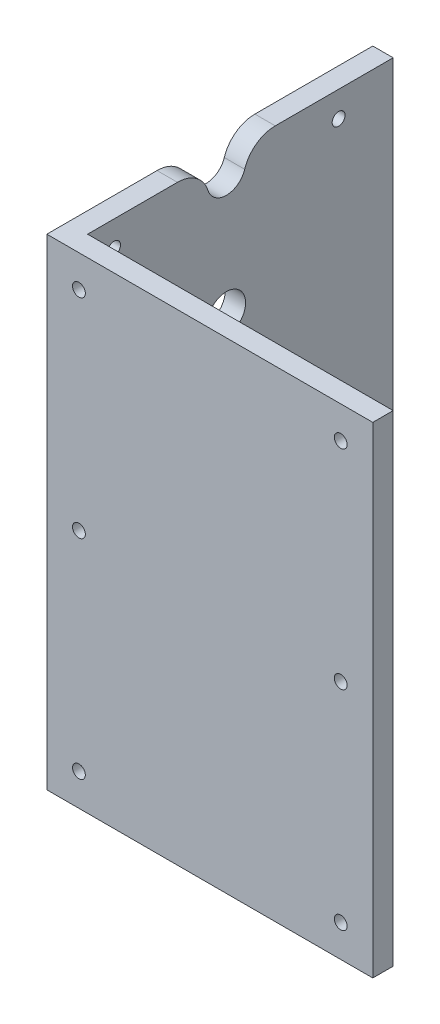
ISO-10303-21;
HEADER;
FILE_DESCRIPTION(('STEP AP214'),'2;1');
FILE_NAME('part.step','',(''),(''),'','','');
FILE_SCHEMA(('AUTOMOTIVE_DESIGN { 1 0 10303 214 1 1 1 1 }'));
ENDSEC;
DATA;
#1=APPLICATION_CONTEXT('core data for automotive mechanical design processes');
#2=APPLICATION_PROTOCOL_DEFINITION('international standard','automotive_design',2000,#1);
#3=PRODUCT_CONTEXT('',#1,'mechanical');
#4=PRODUCT('Part','Part','',(#3));
#5=PRODUCT_RELATED_PRODUCT_CATEGORY('part','',(#4));
#6=PRODUCT_DEFINITION_FORMATION('','',#4);
#7=PRODUCT_DEFINITION_CONTEXT('part definition',#1,'design');
#8=PRODUCT_DEFINITION('design','',#6,#7);
#9=PRODUCT_DEFINITION_SHAPE('','',#8);
#10=(LENGTH_UNIT() NAMED_UNIT(*) SI_UNIT(.MILLI.,.METRE.));
#11=(NAMED_UNIT(*) PLANE_ANGLE_UNIT() SI_UNIT($,.RADIAN.));
#12=(NAMED_UNIT(*) SI_UNIT($,.STERADIAN.) SOLID_ANGLE_UNIT());
#13=UNCERTAINTY_MEASURE_WITH_UNIT(LENGTH_MEASURE(1.E-05),#10,'distance_accuracy_value','');
#14=(GEOMETRIC_REPRESENTATION_CONTEXT(3) GLOBAL_UNCERTAINTY_ASSIGNED_CONTEXT((#13)) GLOBAL_UNIT_ASSIGNED_CONTEXT((#10,
#11,#12)) REPRESENTATION_CONTEXT('',''));
#15=CARTESIAN_POINT('',(0.,0.,0.));
#16=DIRECTION('',(0.,0.,1.));
#17=DIRECTION('',(1.,0.,0.));
#18=AXIS2_PLACEMENT_3D('',#15,#16,#17);
#19=CARTESIAN_POINT('',(101.6,59.96,-49.6));
#20=DIRECTION('',(-1.,0.,0.));
#21=DIRECTION('',(0.,0.,1.));
#22=AXIS2_PLACEMENT_3D('',#19,#20,#21);
#23=CYLINDRICAL_SURFACE('',#22,11.);
#24=CARTESIAN_POINT('',(6.34999999999999,59.96,-49.6));
#25=DIRECTION('',(-1.,0.,0.));
#26=DIRECTION('',(0.,0.,1.));
#27=AXIS2_PLACEMENT_3D('',#24,#25,#26);
#28=CIRCLE('',#27,11.);
#29=CARTESIAN_POINT('',(6.34999999999999,59.96,-38.6));
#30=VERTEX_POINT('',#29);
#31=EDGE_CURVE('E161',#30,#30,#28,.T.);
#32=ORIENTED_EDGE('',*,*,#31,.F.);
#33=EDGE_LOOP('',(#32));
#34=FACE_BOUND('',#33,.T.);
#35=CARTESIAN_POINT('',(1.5,59.96,-49.6));
#36=DIRECTION('',(-1.,0.,0.));
#37=DIRECTION('',(0.,0.,1.));
#38=AXIS2_PLACEMENT_3D('',#35,#36,#37);
#39=CIRCLE('',#38,11.);
#40=CARTESIAN_POINT('',(1.5,59.96,-38.6));
#41=VERTEX_POINT('',#40);
#42=EDGE_CURVE('E182',#41,#41,#39,.F.);
#43=ORIENTED_EDGE('',*,*,#42,.F.);
#44=EDGE_LOOP('',(#43));
#45=FACE_BOUND('',#44,.T.);
#46=ADVANCED_FACE('F40',(#34,#45),#23,.F.);
#47=CARTESIAN_POINT('',(0.,150.,0.));
#48=DIRECTION('',(0.,-1.,0.));
#49=DIRECTION('',(0.,0.,-1.));
#50=AXIS2_PLACEMENT_3D('',#47,#48,#49);
#51=PLANE('',#50);
#52=DIRECTION('',(0.,0.,-1.));
#53=VECTOR('',#52,1.);
#54=CARTESIAN_POINT('',(6.35,150.,-101.6));
#55=LINE('',#54,#53);
#56=CARTESIAN_POINT('',(6.35,150.,-6.35));
#57=VERTEX_POINT('',#56);
#58=CARTESIAN_POINT('',(6.35,150.,-34.3559716610077));
#59=VERTEX_POINT('',#58);
#60=EDGE_CURVE('E280',#57,#59,#55,.T.);
#61=ORIENTED_EDGE('',*,*,#60,.T.);
#62=DIRECTION('',(-1.,0.,0.));
#63=VECTOR('',#62,1.);
#64=CARTESIAN_POINT('',(0.,150.,-34.3559716610077));
#65=LINE('',#64,#63);
#66=CARTESIAN_POINT('',(0.,150.,-34.3559716610077));
#67=VERTEX_POINT('',#66);
#68=EDGE_CURVE('E148',#59,#67,#65,.T.);
#69=ORIENTED_EDGE('',*,*,#68,.T.);
#70=DIRECTION('',(0.,0.,1.));
#71=VECTOR('',#70,1.);
#72=CARTESIAN_POINT('',(0.,150.,-101.6));
#73=LINE('',#72,#71);
#74=CARTESIAN_POINT('',(0.,150.,0.));
#75=VERTEX_POINT('',#74);
#76=EDGE_CURVE('E133',#67,#75,#73,.T.);
#77=ORIENTED_EDGE('',*,*,#76,.T.);
#78=DIRECTION('',(1.,0.,0.));
#79=VECTOR('',#78,1.);
#80=CARTESIAN_POINT('',(0.,150.,0.));
#81=LINE('',#80,#79);
#82=CARTESIAN_POINT('',(101.6,150.,0.));
#83=VERTEX_POINT('',#82);
#84=EDGE_CURVE('E132',#75,#83,#81,.T.);
#85=ORIENTED_EDGE('',*,*,#84,.T.);
#86=DIRECTION('',(0.,0.,-1.));
#87=VECTOR('',#86,1.);
#88=CARTESIAN_POINT('',(101.6,150.,-6.35));
#89=LINE('',#88,#87);
#90=CARTESIAN_POINT('',(101.6,150.,-6.35));
#91=VERTEX_POINT('',#90);
#92=EDGE_CURVE('E276',#83,#91,#89,.T.);
#93=ORIENTED_EDGE('',*,*,#92,.T.);
#94=DIRECTION('',(-1.,0.,0.));
#95=VECTOR('',#94,1.);
#96=CARTESIAN_POINT('',(6.35,150.,-6.35));
#97=LINE('',#96,#95);
#98=EDGE_CURVE('E278',#91,#57,#97,.T.);
#99=ORIENTED_EDGE('',*,*,#98,.T.);
#100=EDGE_LOOP('',(#61,#69,#77,#85,#93,#99));
#101=FACE_BOUND('',#100,.T.);
#102=ADVANCED_FACE('F324',(#101),#51,.F.);
#103=CARTESIAN_POINT('',(0.,150.,-101.6));
#104=DIRECTION('',(0.,0.,1.));
#105=DIRECTION('',(1.,0.,0.));
#106=AXIS2_PLACEMENT_3D('',#103,#104,#105);
#107=PLANE('',#106);
#108=DIRECTION('',(-1.,0.,0.));
#109=VECTOR('',#108,1.);
#110=CARTESIAN_POINT('',(0.,0.,-101.6));
#111=LINE('',#110,#109);
#112=CARTESIAN_POINT('',(6.35,0.,-101.6));
#113=VERTEX_POINT('',#112);
#114=CARTESIAN_POINT('',(0.,0.,-101.6));
#115=VERTEX_POINT('',#114);
#116=EDGE_CURVE('E147',#113,#115,#111,.T.);
#117=ORIENTED_EDGE('',*,*,#116,.T.);
#118=DIRECTION('',(0.,-1.,0.));
#119=VECTOR('',#118,1.);
#120=CARTESIAN_POINT('',(0.,150.,-101.6));
#121=LINE('',#120,#119);
#122=CARTESIAN_POINT('',(0.,150.,-101.6));
#123=VERTEX_POINT('',#122);
#124=EDGE_CURVE('E126',#123,#115,#121,.T.);
#125=ORIENTED_EDGE('',*,*,#124,.F.);
#126=DIRECTION('',(-1.,0.,0.));
#127=VECTOR('',#126,1.);
#128=CARTESIAN_POINT('',(0.,150.,-101.6));
#129=LINE('',#128,#127);
#130=CARTESIAN_POINT('',(6.35,150.,-101.6));
#131=VERTEX_POINT('',#130);
#132=EDGE_CURVE('E136',#131,#123,#129,.T.);
#133=ORIENTED_EDGE('',*,*,#132,.F.);
#134=DIRECTION('',(0.,-1.,0.));
#135=VECTOR('',#134,1.);
#136=CARTESIAN_POINT('',(6.35,150.,-101.6));
#137=LINE('',#136,#135);
#138=EDGE_CURVE('E283',#131,#113,#137,.T.);
#139=ORIENTED_EDGE('',*,*,#138,.T.);
#140=EDGE_LOOP('',(#117,#125,#133,#139));
#141=FACE_BOUND('',#140,.T.);
#142=ADVANCED_FACE('F145',(#141),#107,.F.);
#143=CARTESIAN_POINT('',(0.,150.,-101.6));
#144=DIRECTION('',(1.,0.,0.));
#145=DIRECTION('',(0.,0.,-1.));
#146=AXIS2_PLACEMENT_3D('',#143,#144,#145);
#147=PLANE('',#146);
#148=CARTESIAN_POINT('',(0.,41.31,-49.6));
#149=DIRECTION('',(-1.,0.,0.));
#150=DIRECTION('',(0.,0.,-1.));
#151=AXIS2_PLACEMENT_3D('',#148,#149,#150);
#152=CIRCLE('',#151,2.);
#153=CARTESIAN_POINT('',(0.,41.31,-51.6));
#154=VERTEX_POINT('',#153);
#155=EDGE_CURVE('E243',#154,#154,#152,.T.);
#156=ORIENTED_EDGE('',*,*,#155,.F.);
#157=EDGE_LOOP('',(#156));
#158=FACE_BOUND('',#157,.T.);
#159=CARTESIAN_POINT('',(0.,59.96,-34.6));
#160=DIRECTION('',(-1.,0.,0.));
#161=DIRECTION('',(0.,0.,1.));
#162=AXIS2_PLACEMENT_3D('',#159,#160,#161);
#163=CIRCLE('',#162,1.5);
#164=CARTESIAN_POINT('',(0.,59.96,-33.1));
#165=VERTEX_POINT('',#164);
#166=EDGE_CURVE('E246',#165,#165,#163,.T.);
#167=ORIENTED_EDGE('',*,*,#166,.F.);
#168=EDGE_LOOP('',(#167));
#169=FACE_BOUND('',#168,.T.);
#170=CARTESIAN_POINT('',(0.,46.9696189432334,-57.1));
#171=DIRECTION('',(-1.,0.,0.));
#172=DIRECTION('',(0.,0.,1.));
#173=AXIS2_PLACEMENT_3D('',#170,#171,#172);
#174=CIRCLE('',#173,1.5);
#175=CARTESIAN_POINT('',(0.,46.9696189432334,-55.6));
#176=VERTEX_POINT('',#175);
#177=EDGE_CURVE('E249',#176,#176,#174,.T.);
#178=ORIENTED_EDGE('',*,*,#177,.F.);
#179=EDGE_LOOP('',(#178));
#180=FACE_BOUND('',#179,.T.);
#181=CARTESIAN_POINT('',(0.,72.9503810567666,-57.1));
#182=DIRECTION('',(-1.,0.,0.));
#183=DIRECTION('',(0.,0.,1.));
#184=AXIS2_PLACEMENT_3D('',#181,#182,#183);
#185=CIRCLE('',#184,1.50000000000001);
#186=CARTESIAN_POINT('',(0.,72.9503810567666,-55.6));
#187=VERTEX_POINT('',#186);
#188=EDGE_CURVE('E252',#187,#187,#185,.T.);
#189=ORIENTED_EDGE('',*,*,#188,.F.);
#190=EDGE_LOOP('',(#189));
#191=FACE_BOUND('',#190,.T.);
#192=CARTESIAN_POINT('',(0.,59.96,-26.1));
#193=DIRECTION('',(-1.,0.,0.));
#194=DIRECTION('',(0.,0.,1.));
#195=AXIS2_PLACEMENT_3D('',#192,#193,#194);
#196=CIRCLE('',#195,1.5);
#197=CARTESIAN_POINT('',(0.,59.96,-24.6));
#198=VERTEX_POINT('',#197);
#199=EDGE_CURVE('E239',#198,#198,#196,.T.);
#200=ORIENTED_EDGE('',*,*,#199,.F.);
#201=EDGE_LOOP('',(#200));
#202=FACE_BOUND('',#201,.T.);
#203=CARTESIAN_POINT('',(0.,39.6084030110657,-61.35));
#204=DIRECTION('',(-1.,0.,0.));
#205=DIRECTION('',(0.,0.,1.));
#206=AXIS2_PLACEMENT_3D('',#203,#204,#205);
#207=CIRCLE('',#206,1.50000000000001);
#208=CARTESIAN_POINT('',(0.,39.6084030110657,-59.85));
#209=VERTEX_POINT('',#208);
#210=EDGE_CURVE('E234',#209,#209,#207,.T.);
#211=ORIENTED_EDGE('',*,*,#210,.F.);
#212=EDGE_LOOP('',(#211));
#213=FACE_BOUND('',#212,.T.);
#214=CARTESIAN_POINT('',(0.,80.3115969889343,-61.35));
#215=DIRECTION('',(-1.,0.,0.));
#216=DIRECTION('',(0.,0.,1.));
#217=AXIS2_PLACEMENT_3D('',#214,#215,#216);
#218=CIRCLE('',#217,1.5);
#219=CARTESIAN_POINT('',(0.,80.3115969889343,-59.85));
#220=VERTEX_POINT('',#219);
#221=EDGE_CURVE('E230',#220,#220,#218,.T.);
#222=ORIENTED_EDGE('',*,*,#221,.F.);
#223=EDGE_LOOP('',(#222));
#224=FACE_BOUND('',#223,.T.);
#225=CARTESIAN_POINT('',(0.,78.61,-49.6));
#226=DIRECTION('',(-1.,0.,0.));
#227=DIRECTION('',(0.,0.,1.));
#228=AXIS2_PLACEMENT_3D('',#225,#226,#227);
#229=CIRCLE('',#228,2.);
#230=CARTESIAN_POINT('',(0.,78.61,-47.6));
#231=VERTEX_POINT('',#230);
#232=EDGE_CURVE('E191',#231,#231,#229,.T.);
#233=ORIENTED_EDGE('',*,*,#232,.F.);
#234=EDGE_LOOP('',(#233));
#235=FACE_BOUND('',#234,.T.);
#236=CARTESIAN_POINT('',(0.,59.96,-49.6));
#237=DIRECTION('',(-1.,0.,0.));
#238=DIRECTION('',(0.,0.,1.));
#239=AXIS2_PLACEMENT_3D('',#236,#237,#238);
#240=CIRCLE('',#239,12.5);
#241=CARTESIAN_POINT('',(0.,59.96,-37.1));
#242=VERTEX_POINT('',#241);
#243=EDGE_CURVE('E212',#242,#242,#240,.T.);
#244=ORIENTED_EDGE('',*,*,#243,.F.);
#245=EDGE_LOOP('',(#244));
#246=FACE_BOUND('',#245,.T.);
#247=CARTESIAN_POINT('',(0.,142.,-84.6));
#248=DIRECTION('',(-1.,0.,0.));
#249=DIRECTION('',(0.,0.,1.));
#250=AXIS2_PLACEMENT_3D('',#247,#248,#249);
#251=CIRCLE('',#250,2.);
#252=CARTESIAN_POINT('',(0.,142.,-82.6));
#253=VERTEX_POINT('',#252);
#254=EDGE_CURVE('E261',#253,#253,#251,.T.);
#255=ORIENTED_EDGE('',*,*,#254,.F.);
#256=EDGE_LOOP('',(#255));
#257=FACE_BOUND('',#256,.T.);
#258=CARTESIAN_POINT('',(0.,106.86,-49.6));
#259=DIRECTION('',(-1.,0.,0.));
#260=DIRECTION('',(0.,0.,1.));
#261=AXIS2_PLACEMENT_3D('',#258,#259,#260);
#262=CIRCLE('',#261,6.);
#263=CARTESIAN_POINT('',(0.,106.86,-43.6));
#264=VERTEX_POINT('',#263);
#265=EDGE_CURVE('E185',#264,#264,#262,.T.);
#266=ORIENTED_EDGE('',*,*,#265,.F.);
#267=EDGE_LOOP('',(#266));
#268=FACE_BOUND('',#267,.T.);
#269=CARTESIAN_POINT('',(0.,142.,-14.6));
#270=DIRECTION('',(-1.,0.,0.));
#271=DIRECTION('',(0.,0.,-1.));
#272=AXIS2_PLACEMENT_3D('',#269,#270,#271);
#273=CIRCLE('',#272,2.);
#274=CARTESIAN_POINT('',(0.,142.,-16.6));
#275=VERTEX_POINT('',#274);
#276=EDGE_CURVE('E264',#275,#275,#273,.T.);
#277=ORIENTED_EDGE('',*,*,#276,.F.);
#278=EDGE_LOOP('',(#277));
#279=FACE_BOUND('',#278,.T.);
#280=CARTESIAN_POINT('',(0.,7.70999999999999,-49.6));
#281=DIRECTION('',(-1.,0.,0.));
#282=DIRECTION('',(0.,0.,1.));
#283=AXIS2_PLACEMENT_3D('',#280,#281,#282);
#284=CIRCLE('',#283,1.5);
#285=CARTESIAN_POINT('',(0.,7.70999999999999,-48.1));
#286=VERTEX_POINT('',#285);
#287=EDGE_CURVE('E268',#286,#286,#284,.T.);
#288=ORIENTED_EDGE('',*,*,#287,.F.);
#289=EDGE_LOOP('',(#288));
#290=FACE_BOUND('',#289,.T.);
#291=ORIENTED_EDGE('',*,*,#76,.F.);
#292=CARTESIAN_POINT('',(0.,140.,-34.3559716610077));
#293=DIRECTION('',(1.,0.,0.));
#294=DIRECTION('',(0.,0.,-1.));
#295=AXIS2_PLACEMENT_3D('',#292,#293,#294);
#296=CIRCLE('',#295,10.);
#297=CARTESIAN_POINT('',(0.,143.0375,-43.8834893728779));
#298=VERTEX_POINT('',#297);
#299=EDGE_CURVE('E175',#67,#298,#296,.F.);
#300=ORIENTED_EDGE('',*,*,#299,.T.);
#301=CARTESIAN_POINT('',(0.,144.86,-49.6));
#302=DIRECTION('',(-1.,0.,0.));
#303=DIRECTION('',(0.,0.,1.));
#304=AXIS2_PLACEMENT_3D('',#301,#302,#303);
#305=CIRCLE('',#304,6.00000000000001);
#306=CARTESIAN_POINT('',(0.,143.0375,-55.3165106271221));
#307=VERTEX_POINT('',#306);
#308=EDGE_CURVE('E267',#307,#298,#305,.T.);
#309=ORIENTED_EDGE('',*,*,#308,.F.);
#310=CARTESIAN_POINT('',(0.,140.,-64.8440283389923));
#311=DIRECTION('',(1.,0.,0.));
#312=DIRECTION('',(0.,0.,-1.));
#313=AXIS2_PLACEMENT_3D('',#310,#311,#312);
#314=CIRCLE('',#313,10.);
#315=CARTESIAN_POINT('',(0.,150.,-64.8440283389923));
#316=VERTEX_POINT('',#315);
#317=EDGE_CURVE('E130',#307,#316,#314,.F.);
#318=ORIENTED_EDGE('',*,*,#317,.T.);
#319=EDGE_CURVE('E121',#123,#316,#73,.T.);
#320=ORIENTED_EDGE('',*,*,#319,.F.);
#321=ORIENTED_EDGE('',*,*,#124,.T.);
#322=DIRECTION('',(0.,0.,1.));
#323=VECTOR('',#322,1.);
#324=CARTESIAN_POINT('',(0.,0.,-101.6));
#325=LINE('',#324,#323);
#326=CARTESIAN_POINT('',(0.,0.,0.));
#327=VERTEX_POINT('',#326);
#328=EDGE_CURVE('E285',#115,#327,#325,.T.);
#329=ORIENTED_EDGE('',*,*,#328,.T.);
#330=DIRECTION('',(0.,-1.,0.));
#331=VECTOR('',#330,1.);
#332=CARTESIAN_POINT('',(0.,150.,0.));
#333=LINE('',#332,#331);
#334=EDGE_CURVE('E149',#75,#327,#333,.T.);
#335=ORIENTED_EDGE('',*,*,#334,.F.);
#336=EDGE_LOOP('',(#291,#300,#309,#318,#320,#321,#329,#335));
#337=FACE_BOUND('',#336,.T.);
#338=ADVANCED_FACE('F124',(#158,#169,#180,#191,#202,#213,#224,#235,#246,#257,#268,#279,#290,
#337),#147,.F.);
#339=CARTESIAN_POINT('',(0.,150.,0.));
#340=DIRECTION('',(0.,0.,-1.));
#341=DIRECTION('',(-1.,0.,0.));
#342=AXIS2_PLACEMENT_3D('',#339,#340,#341);
#343=PLANE('',#342);
#344=CARTESIAN_POINT('',(9.99999999999999,140.,0.));
#345=DIRECTION('',(0.,0.,1.));
#346=DIRECTION('',(-1.,0.,0.));
#347=AXIS2_PLACEMENT_3D('',#344,#345,#346);
#348=CIRCLE('',#347,2.);
#349=CARTESIAN_POINT('',(8.,140.,0.));
#350=VERTEX_POINT('',#349);
#351=EDGE_CURVE('E575',#350,#350,#348,.T.);
#352=ORIENTED_EDGE('',*,*,#351,.F.);
#353=EDGE_LOOP('',(#352));
#354=FACE_BOUND('',#353,.T.);
#355=CARTESIAN_POINT('',(10.,75.,0.));
#356=DIRECTION('',(0.,0.,1.));
#357=DIRECTION('',(-1.,0.,0.));
#358=AXIS2_PLACEMENT_3D('',#355,#356,#357);
#359=CIRCLE('',#358,2.00000000000001);
#360=CARTESIAN_POINT('',(8.,75.,0.));
#361=VERTEX_POINT('',#360);
#362=EDGE_CURVE('E576',#361,#361,#359,.T.);
#363=ORIENTED_EDGE('',*,*,#362,.F.);
#364=EDGE_LOOP('',(#363));
#365=FACE_BOUND('',#364,.T.);
#366=CARTESIAN_POINT('',(10.,10.,0.));
#367=DIRECTION('',(0.,0.,1.));
#368=DIRECTION('',(1.,0.,0.));
#369=AXIS2_PLACEMENT_3D('',#366,#367,#368);
#370=CIRCLE('',#369,2.);
#371=CARTESIAN_POINT('',(12.,10.,0.));
#372=VERTEX_POINT('',#371);
#373=EDGE_CURVE('E579',#372,#372,#370,.T.);
#374=ORIENTED_EDGE('',*,*,#373,.F.);
#375=EDGE_LOOP('',(#374));
#376=FACE_BOUND('',#375,.T.);
#377=CARTESIAN_POINT('',(91.6,10.,0.));
#378=DIRECTION('',(0.,0.,1.));
#379=DIRECTION('',(-1.,0.,0.));
#380=AXIS2_PLACEMENT_3D('',#377,#378,#379);
#381=CIRCLE('',#380,2.);
#382=CARTESIAN_POINT('',(89.6,10.,0.));
#383=VERTEX_POINT('',#382);
#384=EDGE_CURVE('E705',#383,#383,#381,.T.);
#385=ORIENTED_EDGE('',*,*,#384,.F.);
#386=EDGE_LOOP('',(#385));
#387=FACE_BOUND('',#386,.T.);
#388=CARTESIAN_POINT('',(91.6,75.,0.));
#389=DIRECTION('',(0.,0.,1.));
#390=DIRECTION('',(1.,0.,0.));
#391=AXIS2_PLACEMENT_3D('',#388,#389,#390);
#392=CIRCLE('',#391,2.);
#393=CARTESIAN_POINT('',(93.6,75.,0.));
#394=VERTEX_POINT('',#393);
#395=EDGE_CURVE('E583',#394,#394,#392,.T.);
#396=ORIENTED_EDGE('',*,*,#395,.F.);
#397=EDGE_LOOP('',(#396));
#398=FACE_BOUND('',#397,.T.);
#399=CARTESIAN_POINT('',(91.6,140.,0.));
#400=DIRECTION('',(0.,0.,1.));
#401=DIRECTION('',(1.,0.,0.));
#402=AXIS2_PLACEMENT_3D('',#399,#400,#401);
#403=CIRCLE('',#402,2.);
#404=CARTESIAN_POINT('',(93.6,140.,0.));
#405=VERTEX_POINT('',#404);
#406=EDGE_CURVE('E217',#405,#405,#403,.T.);
#407=ORIENTED_EDGE('',*,*,#406,.F.);
#408=EDGE_LOOP('',(#407));
#409=FACE_BOUND('',#408,.T.);
#410=DIRECTION('',(1.,0.,0.));
#411=VECTOR('',#410,1.);
#412=CARTESIAN_POINT('',(0.,0.,0.));
#413=LINE('',#412,#411);
#414=CARTESIAN_POINT('',(101.6,0.,0.));
#415=VERTEX_POINT('',#414);
#416=EDGE_CURVE('E287',#327,#415,#413,.T.);
#417=ORIENTED_EDGE('',*,*,#416,.T.);
#418=DIRECTION('',(0.,-1.,0.));
#419=VECTOR('',#418,1.);
#420=CARTESIAN_POINT('',(101.6,150.,0.));
#421=LINE('',#420,#419);
#422=EDGE_CURVE('E154',#83,#415,#421,.T.);
#423=ORIENTED_EDGE('',*,*,#422,.F.);
#424=ORIENTED_EDGE('',*,*,#84,.F.);
#425=ORIENTED_EDGE('',*,*,#334,.T.);
#426=EDGE_LOOP('',(#417,#423,#424,#425));
#427=FACE_BOUND('',#426,.T.);
#428=ADVANCED_FACE('F329',(#354,#365,#376,#387,#398,#409,#427),#343,.F.);
#429=CARTESIAN_POINT('',(101.6,150.,-6.35));
#430=DIRECTION('',(-1.,0.,0.));
#431=DIRECTION('',(0.,0.,1.));
#432=AXIS2_PLACEMENT_3D('',#429,#430,#431);
#433=PLANE('',#432);
#434=DIRECTION('',(0.,0.,-1.));
#435=VECTOR('',#434,1.);
#436=CARTESIAN_POINT('',(101.6,0.,-6.35));
#437=LINE('',#436,#435);
#438=CARTESIAN_POINT('',(101.6,0.,-6.35));
#439=VERTEX_POINT('',#438);
#440=EDGE_CURVE('E289',#415,#439,#437,.T.);
#441=ORIENTED_EDGE('',*,*,#440,.T.);
#442=DIRECTION('',(0.,-1.,0.));
#443=VECTOR('',#442,1.);
#444=CARTESIAN_POINT('',(101.6,150.,-6.35));
#445=LINE('',#444,#443);
#446=EDGE_CURVE('E298',#91,#439,#445,.T.);
#447=ORIENTED_EDGE('',*,*,#446,.F.);
#448=ORIENTED_EDGE('',*,*,#92,.F.);
#449=ORIENTED_EDGE('',*,*,#422,.T.);
#450=EDGE_LOOP('',(#441,#447,#448,#449));
#451=FACE_BOUND('',#450,.T.);
#452=ADVANCED_FACE('F305',(#451),#433,.F.);
#453=CARTESIAN_POINT('',(6.35,150.,-6.35));
#454=DIRECTION('',(0.,0.,1.));
#455=DIRECTION('',(1.,0.,0.));
#456=AXIS2_PLACEMENT_3D('',#453,#454,#455);
#457=PLANE('',#456);
#458=CARTESIAN_POINT('',(9.99999999999999,140.,-6.34999999999999));
#459=DIRECTION('',(0.,0.,1.));
#460=DIRECTION('',(1.,0.,0.));
#461=AXIS2_PLACEMENT_3D('',#458,#459,#460);
#462=CIRCLE('',#461,2.);
#463=CARTESIAN_POINT('',(12.,140.,-6.34999999999999));
#464=VERTEX_POINT('',#463);
#465=EDGE_CURVE('E44',#464,#464,#462,.T.);
#466=ORIENTED_EDGE('',*,*,#465,.T.);
#467=EDGE_LOOP('',(#466));
#468=FACE_BOUND('',#467,.T.);
#469=CARTESIAN_POINT('',(10.,75.,-6.34999999999999));
#470=DIRECTION('',(0.,0.,1.));
#471=DIRECTION('',(1.,0.,0.));
#472=AXIS2_PLACEMENT_3D('',#469,#470,#471);
#473=CIRCLE('',#472,2.00000000000001);
#474=CARTESIAN_POINT('',(12.,75.,-6.34999999999999));
#475=VERTEX_POINT('',#474);
#476=EDGE_CURVE('E225',#475,#475,#473,.T.);
#477=ORIENTED_EDGE('',*,*,#476,.T.);
#478=EDGE_LOOP('',(#477));
#479=FACE_BOUND('',#478,.T.);
#480=CARTESIAN_POINT('',(10.,10.,-6.34999999999999));
#481=DIRECTION('',(0.,0.,1.));
#482=DIRECTION('',(1.,0.,0.));
#483=AXIS2_PLACEMENT_3D('',#480,#481,#482);
#484=CIRCLE('',#483,2.);
#485=CARTESIAN_POINT('',(12.,10.,-6.34999999999999));
#486=VERTEX_POINT('',#485);
#487=EDGE_CURVE('E223',#486,#486,#484,.T.);
#488=ORIENTED_EDGE('',*,*,#487,.T.);
#489=EDGE_LOOP('',(#488));
#490=FACE_BOUND('',#489,.T.);
#491=CARTESIAN_POINT('',(91.6,10.,-6.34999999999999));
#492=DIRECTION('',(0.,0.,1.));
#493=DIRECTION('',(1.,0.,0.));
#494=AXIS2_PLACEMENT_3D('',#491,#492,#493);
#495=CIRCLE('',#494,2.);
#496=CARTESIAN_POINT('',(93.6,10.,-6.34999999999999));
#497=VERTEX_POINT('',#496);
#498=EDGE_CURVE('E220',#497,#497,#495,.T.);
#499=ORIENTED_EDGE('',*,*,#498,.T.);
#500=EDGE_LOOP('',(#499));
#501=FACE_BOUND('',#500,.T.);
#502=CARTESIAN_POINT('',(91.6,75.,-6.34999999999999));
#503=DIRECTION('',(0.,0.,1.));
#504=DIRECTION('',(1.,0.,0.));
#505=AXIS2_PLACEMENT_3D('',#502,#503,#504);
#506=CIRCLE('',#505,2.);
#507=CARTESIAN_POINT('',(93.6,75.,-6.34999999999999));
#508=VERTEX_POINT('',#507);
#509=EDGE_CURVE('E216',#508,#508,#506,.T.);
#510=ORIENTED_EDGE('',*,*,#509,.T.);
#511=EDGE_LOOP('',(#510));
#512=FACE_BOUND('',#511,.T.);
#513=CARTESIAN_POINT('',(91.6,140.,-6.34999999999999));
#514=DIRECTION('',(0.,0.,1.));
#515=DIRECTION('',(1.,0.,0.));
#516=AXIS2_PLACEMENT_3D('',#513,#514,#515);
#517=CIRCLE('',#516,2.);
#518=CARTESIAN_POINT('',(93.6,140.,-6.34999999999999));
#519=VERTEX_POINT('',#518);
#520=EDGE_CURVE('E213',#519,#519,#517,.T.);
#521=ORIENTED_EDGE('',*,*,#520,.T.);
#522=EDGE_LOOP('',(#521));
#523=FACE_BOUND('',#522,.T.);
#524=DIRECTION('',(-1.,0.,0.));
#525=VECTOR('',#524,1.);
#526=CARTESIAN_POINT('',(6.35,0.,-6.35));
#527=LINE('',#526,#525);
#528=CARTESIAN_POINT('',(6.35,0.,-6.35));
#529=VERTEX_POINT('',#528);
#530=EDGE_CURVE('E291',#439,#529,#527,.T.);
#531=ORIENTED_EDGE('',*,*,#530,.T.);
#532=DIRECTION('',(0.,-1.,0.));
#533=VECTOR('',#532,1.);
#534=CARTESIAN_POINT('',(6.35,150.,-6.35));
#535=LINE('',#534,#533);
#536=EDGE_CURVE('E295',#57,#529,#535,.T.);
#537=ORIENTED_EDGE('',*,*,#536,.F.);
#538=ORIENTED_EDGE('',*,*,#98,.F.);
#539=ORIENTED_EDGE('',*,*,#446,.T.);
#540=EDGE_LOOP('',(#531,#537,#538,#539));
#541=FACE_BOUND('',#540,.T.);
#542=ADVANCED_FACE('F316',(#468,#479,#490,#501,#512,#523,#541),#457,.F.);
#543=CARTESIAN_POINT('',(6.35,150.,-101.6));
#544=DIRECTION('',(-1.,0.,0.));
#545=DIRECTION('',(0.,0.,1.));
#546=AXIS2_PLACEMENT_3D('',#543,#544,#545);
#547=PLANE('',#546);
#548=CARTESIAN_POINT('',(6.34999999999999,41.31,-49.6));
#549=DIRECTION('',(-1.,0.,0.));
#550=DIRECTION('',(0.,0.,1.));
#551=AXIS2_PLACEMENT_3D('',#548,#549,#550);
#552=CIRCLE('',#551,2.);
#553=CARTESIAN_POINT('',(6.34999999999999,41.31,-47.6));
#554=VERTEX_POINT('',#553);
#555=EDGE_CURVE('E209',#554,#554,#552,.T.);
#556=ORIENTED_EDGE('',*,*,#555,.T.);
#557=EDGE_LOOP('',(#556));
#558=FACE_BOUND('',#557,.T.);
#559=CARTESIAN_POINT('',(6.34999999999999,59.96,-34.6));
#560=DIRECTION('',(-1.,0.,0.));
#561=DIRECTION('',(0.,0.,1.));
#562=AXIS2_PLACEMENT_3D('',#559,#560,#561);
#563=CIRCLE('',#562,1.5);
#564=CARTESIAN_POINT('',(6.34999999999999,59.96,-33.1));
#565=VERTEX_POINT('',#564);
#566=EDGE_CURVE('E206',#565,#565,#563,.T.);
#567=ORIENTED_EDGE('',*,*,#566,.T.);
#568=EDGE_LOOP('',(#567));
#569=FACE_BOUND('',#568,.T.);
#570=CARTESIAN_POINT('',(6.34999999999999,46.9696189432334,-57.1));
#571=DIRECTION('',(-1.,0.,0.));
#572=DIRECTION('',(0.,0.,1.));
#573=AXIS2_PLACEMENT_3D('',#570,#571,#572);
#574=CIRCLE('',#573,1.5);
#575=CARTESIAN_POINT('',(6.34999999999999,46.9696189432334,-55.6));
#576=VERTEX_POINT('',#575);
#577=EDGE_CURVE('E203',#576,#576,#574,.T.);
#578=ORIENTED_EDGE('',*,*,#577,.T.);
#579=EDGE_LOOP('',(#578));
#580=FACE_BOUND('',#579,.T.);
#581=CARTESIAN_POINT('',(6.34999999999999,72.9503810567666,-57.1));
#582=DIRECTION('',(-1.,0.,0.));
#583=DIRECTION('',(0.,0.,1.));
#584=AXIS2_PLACEMENT_3D('',#581,#582,#583);
#585=CIRCLE('',#584,1.50000000000001);
#586=CARTESIAN_POINT('',(6.34999999999999,72.9503810567666,-55.6));
#587=VERTEX_POINT('',#586);
#588=EDGE_CURVE('E200',#587,#587,#585,.T.);
#589=ORIENTED_EDGE('',*,*,#588,.T.);
#590=EDGE_LOOP('',(#589));
#591=FACE_BOUND('',#590,.T.);
#592=CARTESIAN_POINT('',(6.34999999999999,59.96,-26.1));
#593=DIRECTION('',(-1.,0.,0.));
#594=DIRECTION('',(0.,0.,1.));
#595=AXIS2_PLACEMENT_3D('',#592,#593,#594);
#596=CIRCLE('',#595,1.5);
#597=CARTESIAN_POINT('',(6.34999999999999,59.96,-24.6));
#598=VERTEX_POINT('',#597);
#599=EDGE_CURVE('E197',#598,#598,#596,.T.);
#600=ORIENTED_EDGE('',*,*,#599,.T.);
#601=EDGE_LOOP('',(#600));
#602=FACE_BOUND('',#601,.T.);
#603=CARTESIAN_POINT('',(6.34999999999999,39.6084030110657,-61.35));
#604=DIRECTION('',(-1.,0.,0.));
#605=DIRECTION('',(0.,0.,1.));
#606=AXIS2_PLACEMENT_3D('',#603,#604,#605);
#607=CIRCLE('',#606,1.50000000000001);
#608=CARTESIAN_POINT('',(6.34999999999999,39.6084030110657,-59.85));
#609=VERTEX_POINT('',#608);
#610=EDGE_CURVE('E194',#609,#609,#607,.T.);
#611=ORIENTED_EDGE('',*,*,#610,.T.);
#612=EDGE_LOOP('',(#611));
#613=FACE_BOUND('',#612,.T.);
#614=CARTESIAN_POINT('',(6.34999999999999,80.3115969889343,-61.35));
#615=DIRECTION('',(-1.,0.,0.));
#616=DIRECTION('',(0.,0.,1.));
#617=AXIS2_PLACEMENT_3D('',#614,#615,#616);
#618=CIRCLE('',#617,1.5);
#619=CARTESIAN_POINT('',(6.34999999999999,80.3115969889343,-59.85));
#620=VERTEX_POINT('',#619);
#621=EDGE_CURVE('E190',#620,#620,#618,.T.);
#622=ORIENTED_EDGE('',*,*,#621,.T.);
#623=EDGE_LOOP('',(#622));
#624=FACE_BOUND('',#623,.T.);
#625=CARTESIAN_POINT('',(6.34999999999999,78.61,-49.6));
#626=DIRECTION('',(-1.,0.,0.));
#627=DIRECTION('',(0.,0.,1.));
#628=AXIS2_PLACEMENT_3D('',#625,#626,#627);
#629=CIRCLE('',#628,2.);
#630=CARTESIAN_POINT('',(6.34999999999999,78.61,-47.6));
#631=VERTEX_POINT('',#630);
#632=EDGE_CURVE('E187',#631,#631,#629,.T.);
#633=ORIENTED_EDGE('',*,*,#632,.T.);
#634=EDGE_LOOP('',(#633));
#635=FACE_BOUND('',#634,.T.);
#636=CARTESIAN_POINT('',(6.34999999999999,142.,-84.6));
#637=DIRECTION('',(-1.,0.,0.));
#638=DIRECTION('',(0.,0.,1.));
#639=AXIS2_PLACEMENT_3D('',#636,#637,#638);
#640=CIRCLE('',#639,2.);
#641=CARTESIAN_POINT('',(6.34999999999999,142.,-82.6));
#642=VERTEX_POINT('',#641);
#643=EDGE_CURVE('E171',#642,#642,#640,.T.);
#644=ORIENTED_EDGE('',*,*,#643,.T.);
#645=EDGE_LOOP('',(#644));
#646=FACE_BOUND('',#645,.T.);
#647=CARTESIAN_POINT('',(6.34999999999999,106.86,-49.6));
#648=DIRECTION('',(-1.,0.,0.));
#649=DIRECTION('',(0.,0.,1.));
#650=AXIS2_PLACEMENT_3D('',#647,#648,#649);
#651=CIRCLE('',#650,6.);
#652=CARTESIAN_POINT('',(6.34999999999999,106.86,-43.6));
#653=VERTEX_POINT('',#652);
#654=EDGE_CURVE('E168',#653,#653,#651,.T.);
#655=ORIENTED_EDGE('',*,*,#654,.T.);
#656=EDGE_LOOP('',(#655));
#657=FACE_BOUND('',#656,.T.);
#658=CARTESIAN_POINT('',(6.34999999999999,142.,-14.6));
#659=DIRECTION('',(-1.,0.,0.));
#660=DIRECTION('',(0.,0.,1.));
#661=AXIS2_PLACEMENT_3D('',#658,#659,#660);
#662=CIRCLE('',#661,2.);
#663=CARTESIAN_POINT('',(6.34999999999999,142.,-12.6));
#664=VERTEX_POINT('',#663);
#665=EDGE_CURVE('E165',#664,#664,#662,.T.);
#666=ORIENTED_EDGE('',*,*,#665,.T.);
#667=EDGE_LOOP('',(#666));
#668=FACE_BOUND('',#667,.T.);
#669=ORIENTED_EDGE('',*,*,#31,.T.);
#670=EDGE_LOOP('',(#669));
#671=FACE_BOUND('',#670,.T.);
#672=CARTESIAN_POINT('',(6.34999999999999,7.70999999999999,-49.6));
#673=DIRECTION('',(-1.,0.,0.));
#674=DIRECTION('',(0.,0.,1.));
#675=AXIS2_PLACEMENT_3D('',#672,#673,#674);
#676=CIRCLE('',#675,1.5);
#677=CARTESIAN_POINT('',(6.34999999999999,7.70999999999999,-48.1));
#678=VERTEX_POINT('',#677);
#679=EDGE_CURVE('E158',#678,#678,#676,.T.);
#680=ORIENTED_EDGE('',*,*,#679,.T.);
#681=EDGE_LOOP('',(#680));
#682=FACE_BOUND('',#681,.T.);
#683=CARTESIAN_POINT('',(6.34999999999999,144.86,-49.6));
#684=DIRECTION('',(-1.,0.,0.));
#685=DIRECTION('',(0.,0.,1.));
#686=AXIS2_PLACEMENT_3D('',#683,#684,#685);
#687=CIRCLE('',#686,6.00000000000001);
#688=CARTESIAN_POINT('',(6.34999999999999,143.0375,-55.3165106271221));
#689=VERTEX_POINT('',#688);
#690=CARTESIAN_POINT('',(6.34999999999999,143.0375,-43.8834893728779));
#691=VERTEX_POINT('',#690);
#692=EDGE_CURVE('E162',#689,#691,#687,.T.);
#693=ORIENTED_EDGE('',*,*,#692,.T.);
#694=CARTESIAN_POINT('',(6.34999999999999,140.,-34.3559716610077));
#695=DIRECTION('',(-1.,0.,0.));
#696=DIRECTION('',(0.,0.,1.));
#697=AXIS2_PLACEMENT_3D('',#694,#695,#696);
#698=CIRCLE('',#697,10.);
#699=EDGE_CURVE('E49',#691,#59,#698,.F.);
#700=ORIENTED_EDGE('',*,*,#699,.T.);
#701=ORIENTED_EDGE('',*,*,#60,.F.);
#702=ORIENTED_EDGE('',*,*,#536,.T.);
#703=DIRECTION('',(0.,0.,-1.));
#704=VECTOR('',#703,1.);
#705=CARTESIAN_POINT('',(6.35,0.,-101.6));
#706=LINE('',#705,#704);
#707=EDGE_CURVE('E143',#529,#113,#706,.T.);
#708=ORIENTED_EDGE('',*,*,#707,.T.);
#709=ORIENTED_EDGE('',*,*,#138,.F.);
#710=CARTESIAN_POINT('',(6.35,150.,-64.8440283389923));
#711=VERTEX_POINT('',#710);
#712=EDGE_CURVE('E139',#711,#131,#55,.T.);
#713=ORIENTED_EDGE('',*,*,#712,.F.);
#714=CARTESIAN_POINT('',(6.34999999999999,140.,-64.8440283389923));
#715=DIRECTION('',(-1.,0.,0.));
#716=DIRECTION('',(0.,0.,1.));
#717=AXIS2_PLACEMENT_3D('',#714,#715,#716);
#718=CIRCLE('',#717,10.);
#719=EDGE_CURVE('E57',#711,#689,#718,.F.);
#720=ORIENTED_EDGE('',*,*,#719,.T.);
#721=EDGE_LOOP('',(#693,#700,#701,#702,#708,#709,#713,#720));
#722=FACE_BOUND('',#721,.T.);
#723=ADVANCED_FACE('F320',(#558,#569,#580,#591,#602,#613,#624,#635,#646,#657,#668,#671,#682,
#722),#547,.F.);
#724=ORIENTED_EDGE('',*,*,#319,.T.);
#725=DIRECTION('',(-1.,0.,0.));
#726=VECTOR('',#725,1.);
#727=CARTESIAN_POINT('',(0.,150.,-64.8440283389923));
#728=LINE('',#727,#726);
#729=EDGE_CURVE('E11',#316,#711,#728,.F.);
#730=ORIENTED_EDGE('',*,*,#729,.T.);
#731=ORIENTED_EDGE('',*,*,#712,.T.);
#732=ORIENTED_EDGE('',*,*,#132,.T.);
#733=EDGE_LOOP('',(#724,#730,#731,#732));
#734=FACE_BOUND('',#733,.T.);
#735=ADVANCED_FACE('F137',(#734),#51,.F.);
#736=CARTESIAN_POINT('',(0.,0.,0.));
#737=DIRECTION('',(0.,-1.,0.));
#738=DIRECTION('',(0.,0.,-1.));
#739=AXIS2_PLACEMENT_3D('',#736,#737,#738);
#740=PLANE('',#739);
#741=ORIENTED_EDGE('',*,*,#116,.F.);
#742=ORIENTED_EDGE('',*,*,#707,.F.);
#743=ORIENTED_EDGE('',*,*,#530,.F.);
#744=ORIENTED_EDGE('',*,*,#440,.F.);
#745=ORIENTED_EDGE('',*,*,#416,.F.);
#746=ORIENTED_EDGE('',*,*,#328,.F.);
#747=EDGE_LOOP('',(#741,#742,#743,#744,#745,#746));
#748=FACE_BOUND('',#747,.T.);
#749=ADVANCED_FACE('F312',(#748),#740,.T.);
#750=CARTESIAN_POINT('',(101.6,144.86,-49.6));
#751=DIRECTION('',(-1.,0.,0.));
#752=DIRECTION('',(0.,0.,1.));
#753=AXIS2_PLACEMENT_3D('',#750,#751,#752);
#754=CYLINDRICAL_SURFACE('',#753,6.00000000000001);
#755=ORIENTED_EDGE('',*,*,#308,.T.);
#756=DIRECTION('',(-1.,0.,0.));
#757=VECTOR('',#756,1.);
#758=CARTESIAN_POINT('',(101.6,143.0375,-43.8834893728779));
#759=LINE('',#758,#757);
#760=EDGE_CURVE('E64',#298,#691,#759,.F.);
#761=ORIENTED_EDGE('',*,*,#760,.T.);
#762=ORIENTED_EDGE('',*,*,#692,.F.);
#763=DIRECTION('',(-1.,0.,0.));
#764=VECTOR('',#763,1.);
#765=CARTESIAN_POINT('',(101.6,143.0375,-55.3165106271221));
#766=LINE('',#765,#764);
#767=EDGE_CURVE('E177',#689,#307,#766,.T.);
#768=ORIENTED_EDGE('',*,*,#767,.T.);
#769=EDGE_LOOP('',(#755,#761,#762,#768));
#770=FACE_BOUND('',#769,.T.);
#771=ADVANCED_FACE('F328',(#770),#754,.F.);
#772=CARTESIAN_POINT('',(101.6,7.70999999999999,-49.6));
#773=DIRECTION('',(-1.,0.,0.));
#774=DIRECTION('',(0.,0.,1.));
#775=AXIS2_PLACEMENT_3D('',#772,#773,#774);
#776=CYLINDRICAL_SURFACE('',#775,1.5);
#777=ORIENTED_EDGE('',*,*,#287,.T.);
#778=EDGE_LOOP('',(#777));
#779=FACE_BOUND('',#778,.T.);
#780=ORIENTED_EDGE('',*,*,#679,.F.);
#781=EDGE_LOOP('',(#780));
#782=FACE_BOUND('',#781,.T.);
#783=ADVANCED_FACE('F437',(#779,#782),#776,.F.);
#784=CARTESIAN_POINT('',(101.6,142.,-14.6));
#785=DIRECTION('',(-1.,0.,0.));
#786=DIRECTION('',(0.,0.,1.));
#787=AXIS2_PLACEMENT_3D('',#784,#785,#786);
#788=CYLINDRICAL_SURFACE('',#787,2.);
#789=ORIENTED_EDGE('',*,*,#276,.T.);
#790=EDGE_LOOP('',(#789));
#791=FACE_BOUND('',#790,.T.);
#792=ORIENTED_EDGE('',*,*,#665,.F.);
#793=EDGE_LOOP('',(#792));
#794=FACE_BOUND('',#793,.T.);
#795=ADVANCED_FACE('F356',(#791,#794),#788,.F.);
#796=CARTESIAN_POINT('',(101.6,106.86,-49.6));
#797=DIRECTION('',(-1.,0.,0.));
#798=DIRECTION('',(0.,0.,1.));
#799=AXIS2_PLACEMENT_3D('',#796,#797,#798);
#800=CYLINDRICAL_SURFACE('',#799,6.);
#801=ORIENTED_EDGE('',*,*,#265,.T.);
#802=EDGE_LOOP('',(#801));
#803=FACE_BOUND('',#802,.T.);
#804=ORIENTED_EDGE('',*,*,#654,.F.);
#805=EDGE_LOOP('',(#804));
#806=FACE_BOUND('',#805,.T.);
#807=ADVANCED_FACE('F432',(#803,#806),#800,.F.);
#808=CARTESIAN_POINT('',(101.6,142.,-84.6));
#809=DIRECTION('',(-1.,0.,0.));
#810=DIRECTION('',(0.,0.,1.));
#811=AXIS2_PLACEMENT_3D('',#808,#809,#810);
#812=CYLINDRICAL_SURFACE('',#811,2.);
#813=ORIENTED_EDGE('',*,*,#254,.T.);
#814=EDGE_LOOP('',(#813));
#815=FACE_BOUND('',#814,.T.);
#816=ORIENTED_EDGE('',*,*,#643,.F.);
#817=EDGE_LOOP('',(#816));
#818=FACE_BOUND('',#817,.T.);
#819=ADVANCED_FACE('F429',(#815,#818),#812,.F.);
#820=CARTESIAN_POINT('',(101.6,140.,-34.3559716610077));
#821=DIRECTION('',(-1.,0.,0.));
#822=DIRECTION('',(0.,0.,1.));
#823=AXIS2_PLACEMENT_3D('',#820,#821,#822);
#824=CYLINDRICAL_SURFACE('',#823,10.);
#825=ORIENTED_EDGE('',*,*,#699,.F.);
#826=ORIENTED_EDGE('',*,*,#760,.F.);
#827=ORIENTED_EDGE('',*,*,#299,.F.);
#828=ORIENTED_EDGE('',*,*,#68,.F.);
#829=EDGE_LOOP('',(#825,#826,#827,#828));
#830=FACE_BOUND('',#829,.T.);
#831=ADVANCED_FACE('F326',(#830),#824,.T.);
#832=CARTESIAN_POINT('',(101.6,140.,-64.8440283389923));
#833=DIRECTION('',(-1.,0.,0.));
#834=DIRECTION('',(0.,0.,1.));
#835=AXIS2_PLACEMENT_3D('',#832,#833,#834);
#836=CYLINDRICAL_SURFACE('',#835,10.);
#837=ORIENTED_EDGE('',*,*,#317,.F.);
#838=ORIENTED_EDGE('',*,*,#767,.F.);
#839=ORIENTED_EDGE('',*,*,#719,.F.);
#840=ORIENTED_EDGE('',*,*,#729,.F.);
#841=EDGE_LOOP('',(#837,#838,#839,#840));
#842=FACE_BOUND('',#841,.T.);
#843=ADVANCED_FACE('F42',(#842),#836,.T.);
#844=CARTESIAN_POINT('',(1.5,59.96,-49.6));
#845=DIRECTION('',(-1.,0.,0.));
#846=DIRECTION('',(0.,0.,1.));
#847=AXIS2_PLACEMENT_3D('',#844,#845,#846);
#848=PLANE('',#847);
#849=CARTESIAN_POINT('',(1.5,59.96,-49.6));
#850=DIRECTION('',(-1.,0.,0.));
#851=DIRECTION('',(0.,0.,1.));
#852=AXIS2_PLACEMENT_3D('',#849,#850,#851);
#853=CIRCLE('',#852,12.5);
#854=CARTESIAN_POINT('',(1.5,59.96,-37.1));
#855=VERTEX_POINT('',#854);
#856=EDGE_CURVE('E186',#855,#855,#853,.T.);
#857=ORIENTED_EDGE('',*,*,#856,.T.);
#858=EDGE_LOOP('',(#857));
#859=FACE_BOUND('',#858,.T.);
#860=ORIENTED_EDGE('',*,*,#42,.T.);
#861=EDGE_LOOP('',(#860));
#862=FACE_BOUND('',#861,.T.);
#863=ADVANCED_FACE('F423',(#859,#862),#848,.T.);
#864=CARTESIAN_POINT('',(1.5,59.96,-49.6));
#865=DIRECTION('',(-1.,0.,0.));
#866=DIRECTION('',(0.,0.,1.));
#867=AXIS2_PLACEMENT_3D('',#864,#865,#866);
#868=CYLINDRICAL_SURFACE('',#867,12.5);
#869=ORIENTED_EDGE('',*,*,#856,.F.);
#870=EDGE_LOOP('',(#869));
#871=FACE_BOUND('',#870,.T.);
#872=ORIENTED_EDGE('',*,*,#243,.T.);
#873=EDGE_LOOP('',(#872));
#874=FACE_BOUND('',#873,.T.);
#875=ADVANCED_FACE('F421',(#871,#874),#868,.F.);
#876=CARTESIAN_POINT('',(101.6,78.61,-49.6));
#877=DIRECTION('',(-1.,0.,0.));
#878=DIRECTION('',(0.,0.,1.));
#879=AXIS2_PLACEMENT_3D('',#876,#877,#878);
#880=CYLINDRICAL_SURFACE('',#879,2.);
#881=ORIENTED_EDGE('',*,*,#232,.T.);
#882=EDGE_LOOP('',(#881));
#883=FACE_BOUND('',#882,.T.);
#884=ORIENTED_EDGE('',*,*,#632,.F.);
#885=EDGE_LOOP('',(#884));
#886=FACE_BOUND('',#885,.T.);
#887=ADVANCED_FACE('F407',(#883,#886),#880,.F.);
#888=CARTESIAN_POINT('',(101.6,80.3115969889343,-61.35));
#889=DIRECTION('',(-1.,0.,0.));
#890=DIRECTION('',(0.,0.,1.));
#891=AXIS2_PLACEMENT_3D('',#888,#889,#890);
#892=CYLINDRICAL_SURFACE('',#891,1.5);
#893=ORIENTED_EDGE('',*,*,#221,.T.);
#894=EDGE_LOOP('',(#893));
#895=FACE_BOUND('',#894,.T.);
#896=ORIENTED_EDGE('',*,*,#621,.F.);
#897=EDGE_LOOP('',(#896));
#898=FACE_BOUND('',#897,.T.);
#899=ADVANCED_FACE('F404',(#895,#898),#892,.F.);
#900=CARTESIAN_POINT('',(101.6,39.6084030110657,-61.35));
#901=DIRECTION('',(-1.,0.,0.));
#902=DIRECTION('',(0.,0.,1.));
#903=AXIS2_PLACEMENT_3D('',#900,#901,#902);
#904=CYLINDRICAL_SURFACE('',#903,1.50000000000001);
#905=ORIENTED_EDGE('',*,*,#210,.T.);
#906=EDGE_LOOP('',(#905));
#907=FACE_BOUND('',#906,.T.);
#908=ORIENTED_EDGE('',*,*,#610,.F.);
#909=EDGE_LOOP('',(#908));
#910=FACE_BOUND('',#909,.T.);
#911=ADVANCED_FACE('F400',(#907,#910),#904,.F.);
#912=CARTESIAN_POINT('',(101.6,59.96,-26.1));
#913=DIRECTION('',(-1.,0.,0.));
#914=DIRECTION('',(0.,0.,1.));
#915=AXIS2_PLACEMENT_3D('',#912,#913,#914);
#916=CYLINDRICAL_SURFACE('',#915,1.5);
#917=ORIENTED_EDGE('',*,*,#199,.T.);
#918=EDGE_LOOP('',(#917));
#919=FACE_BOUND('',#918,.T.);
#920=ORIENTED_EDGE('',*,*,#599,.F.);
#921=EDGE_LOOP('',(#920));
#922=FACE_BOUND('',#921,.T.);
#923=ADVANCED_FACE('F396',(#919,#922),#916,.F.);
#924=CARTESIAN_POINT('',(101.6,72.9503810567666,-57.1));
#925=DIRECTION('',(-1.,0.,0.));
#926=DIRECTION('',(0.,0.,1.));
#927=AXIS2_PLACEMENT_3D('',#924,#925,#926);
#928=CYLINDRICAL_SURFACE('',#927,1.50000000000001);
#929=ORIENTED_EDGE('',*,*,#188,.T.);
#930=EDGE_LOOP('',(#929));
#931=FACE_BOUND('',#930,.T.);
#932=ORIENTED_EDGE('',*,*,#588,.F.);
#933=EDGE_LOOP('',(#932));
#934=FACE_BOUND('',#933,.T.);
#935=ADVANCED_FACE('F399',(#931,#934),#928,.F.);
#936=CARTESIAN_POINT('',(101.6,46.9696189432334,-57.1));
#937=DIRECTION('',(-1.,0.,0.));
#938=DIRECTION('',(0.,0.,1.));
#939=AXIS2_PLACEMENT_3D('',#936,#937,#938);
#940=CYLINDRICAL_SURFACE('',#939,1.5);
#941=ORIENTED_EDGE('',*,*,#177,.T.);
#942=EDGE_LOOP('',(#941));
#943=FACE_BOUND('',#942,.T.);
#944=ORIENTED_EDGE('',*,*,#577,.F.);
#945=EDGE_LOOP('',(#944));
#946=FACE_BOUND('',#945,.T.);
#947=ADVANCED_FACE('F411',(#943,#946),#940,.F.);
#948=CARTESIAN_POINT('',(101.6,59.96,-34.6));
#949=DIRECTION('',(-1.,0.,0.));
#950=DIRECTION('',(0.,0.,1.));
#951=AXIS2_PLACEMENT_3D('',#948,#949,#950);
#952=CYLINDRICAL_SURFACE('',#951,1.5);
#953=ORIENTED_EDGE('',*,*,#166,.T.);
#954=EDGE_LOOP('',(#953));
#955=FACE_BOUND('',#954,.T.);
#956=ORIENTED_EDGE('',*,*,#566,.F.);
#957=EDGE_LOOP('',(#956));
#958=FACE_BOUND('',#957,.T.);
#959=ADVANCED_FACE('F388',(#955,#958),#952,.F.);
#960=CARTESIAN_POINT('',(101.6,41.31,-49.6));
#961=DIRECTION('',(-1.,0.,0.));
#962=DIRECTION('',(0.,0.,1.));
#963=AXIS2_PLACEMENT_3D('',#960,#961,#962);
#964=CYLINDRICAL_SURFACE('',#963,2.);
#965=ORIENTED_EDGE('',*,*,#155,.T.);
#966=EDGE_LOOP('',(#965));
#967=FACE_BOUND('',#966,.T.);
#968=ORIENTED_EDGE('',*,*,#555,.F.);
#969=EDGE_LOOP('',(#968));
#970=FACE_BOUND('',#969,.T.);
#971=ADVANCED_FACE('F379',(#967,#970),#964,.F.);
#972=CARTESIAN_POINT('',(91.6,140.,-101.6));
#973=DIRECTION('',(0.,0.,1.));
#974=DIRECTION('',(1.,0.,0.));
#975=AXIS2_PLACEMENT_3D('',#972,#973,#974);
#976=CYLINDRICAL_SURFACE('',#975,2.);
#977=ORIENTED_EDGE('',*,*,#406,.T.);
#978=EDGE_LOOP('',(#977));
#979=FACE_BOUND('',#978,.T.);
#980=ORIENTED_EDGE('',*,*,#520,.F.);
#981=EDGE_LOOP('',(#980));
#982=FACE_BOUND('',#981,.T.);
#983=ADVANCED_FACE('F377',(#979,#982),#976,.F.);
#984=CARTESIAN_POINT('',(91.6,75.,-101.6));
#985=DIRECTION('',(0.,0.,1.));
#986=DIRECTION('',(1.,0.,0.));
#987=AXIS2_PLACEMENT_3D('',#984,#985,#986);
#988=CYLINDRICAL_SURFACE('',#987,2.);
#989=ORIENTED_EDGE('',*,*,#395,.T.);
#990=EDGE_LOOP('',(#989));
#991=FACE_BOUND('',#990,.T.);
#992=ORIENTED_EDGE('',*,*,#509,.F.);
#993=EDGE_LOOP('',(#992));
#994=FACE_BOUND('',#993,.T.);
#995=ADVANCED_FACE('F378',(#991,#994),#988,.F.);
#996=CARTESIAN_POINT('',(91.6,10.,-101.6));
#997=DIRECTION('',(0.,0.,1.));
#998=DIRECTION('',(1.,0.,0.));
#999=AXIS2_PLACEMENT_3D('',#996,#997,#998);
#1000=CYLINDRICAL_SURFACE('',#999,2.);
#1001=ORIENTED_EDGE('',*,*,#384,.T.);
#1002=EDGE_LOOP('',(#1001));
#1003=FACE_BOUND('',#1002,.T.);
#1004=ORIENTED_EDGE('',*,*,#498,.F.);
#1005=EDGE_LOOP('',(#1004));
#1006=FACE_BOUND('',#1005,.T.);
#1007=ADVANCED_FACE('F385',(#1003,#1006),#1000,.F.);
#1008=CARTESIAN_POINT('',(10.,10.,-101.6));
#1009=DIRECTION('',(0.,0.,1.));
#1010=DIRECTION('',(1.,0.,0.));
#1011=AXIS2_PLACEMENT_3D('',#1008,#1009,#1010);
#1012=CYLINDRICAL_SURFACE('',#1011,2.);
#1013=ORIENTED_EDGE('',*,*,#373,.T.);
#1014=EDGE_LOOP('',(#1013));
#1015=FACE_BOUND('',#1014,.T.);
#1016=ORIENTED_EDGE('',*,*,#487,.F.);
#1017=EDGE_LOOP('',(#1016));
#1018=FACE_BOUND('',#1017,.T.);
#1019=ADVANCED_FACE('F543',(#1015,#1018),#1012,.F.);
#1020=CARTESIAN_POINT('',(10.,75.,-101.6));
#1021=DIRECTION('',(0.,0.,1.));
#1022=DIRECTION('',(1.,0.,0.));
#1023=AXIS2_PLACEMENT_3D('',#1020,#1021,#1022);
#1024=CYLINDRICAL_SURFACE('',#1023,2.00000000000001);
#1025=ORIENTED_EDGE('',*,*,#362,.T.);
#1026=EDGE_LOOP('',(#1025));
#1027=FACE_BOUND('',#1026,.T.);
#1028=ORIENTED_EDGE('',*,*,#476,.F.);
#1029=EDGE_LOOP('',(#1028));
#1030=FACE_BOUND('',#1029,.T.);
#1031=ADVANCED_FACE('F553',(#1027,#1030),#1024,.F.);
#1032=CARTESIAN_POINT('',(9.99999999999999,140.,-101.6));
#1033=DIRECTION('',(0.,0.,1.));
#1034=DIRECTION('',(1.,0.,0.));
#1035=AXIS2_PLACEMENT_3D('',#1032,#1033,#1034);
#1036=CYLINDRICAL_SURFACE('',#1035,2.);
#1037=ORIENTED_EDGE('',*,*,#351,.T.);
#1038=EDGE_LOOP('',(#1037));
#1039=FACE_BOUND('',#1038,.T.);
#1040=ORIENTED_EDGE('',*,*,#465,.F.);
#1041=EDGE_LOOP('',(#1040));
#1042=FACE_BOUND('',#1041,.T.);
#1043=ADVANCED_FACE('F394',(#1039,#1042),#1036,.F.);
#1044=CLOSED_SHELL('',(#46,#102,#142,#338,#428,#452,#542,#723,#735,#749,#771,#783,#795,#807,
#819,#831,#843,#863,#875,#887,#899,#911,#923,#935,#947,#959,#971,#983,#995,#1007,#1019,#1031,#1043));
#1045=MANIFOLD_SOLID_BREP('B2',#1044);
#1046=ADVANCED_BREP_SHAPE_REPRESENTATION('',(#18,#1045),#14);
#1047=SHAPE_DEFINITION_REPRESENTATION(#9,#1046);
ENDSEC;
END-ISO-10303-21;
